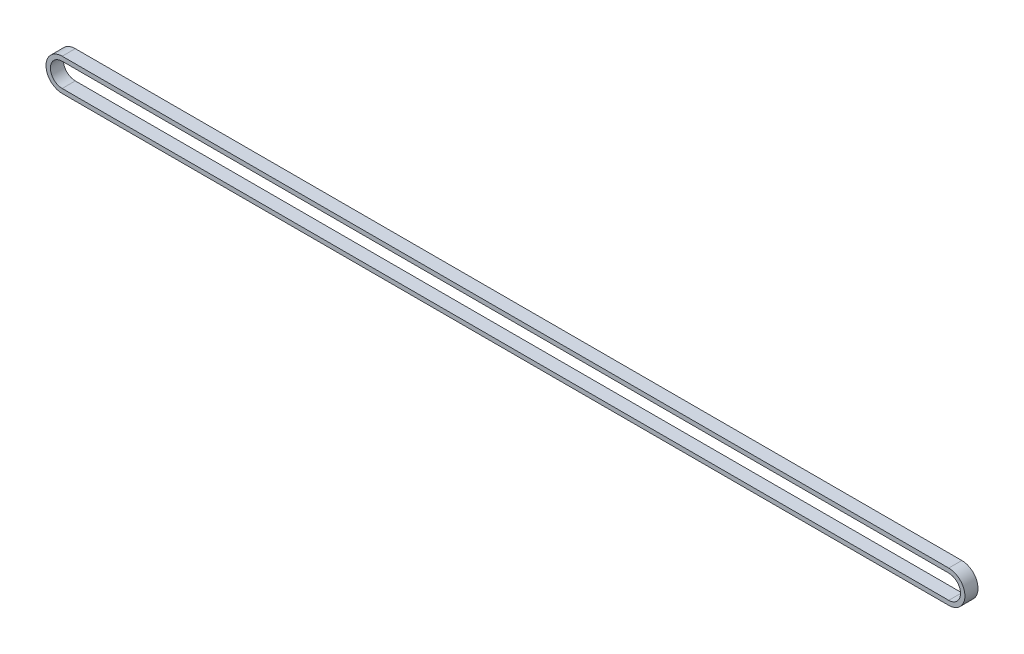
ISO-10303-21;
HEADER;
FILE_DESCRIPTION(('STEP AP214'),'2;1');
FILE_NAME('part.step','',(''),(''),'','','');
FILE_SCHEMA(('AUTOMOTIVE_DESIGN { 1 0 10303 214 1 1 1 1 }'));
ENDSEC;
DATA;
#1=APPLICATION_CONTEXT('core data for automotive mechanical design processes');
#2=APPLICATION_PROTOCOL_DEFINITION('international standard','automotive_design',2000,#1);
#3=PRODUCT_CONTEXT('',#1,'mechanical');
#4=PRODUCT('Part','Part','',(#3));
#5=PRODUCT_RELATED_PRODUCT_CATEGORY('part','',(#4));
#6=PRODUCT_DEFINITION_FORMATION('','',#4);
#7=PRODUCT_DEFINITION_CONTEXT('part definition',#1,'design');
#8=PRODUCT_DEFINITION('design','',#6,#7);
#9=PRODUCT_DEFINITION_SHAPE('','',#8);
#10=(LENGTH_UNIT() NAMED_UNIT(*) SI_UNIT(.MILLI.,.METRE.));
#11=(NAMED_UNIT(*) PLANE_ANGLE_UNIT() SI_UNIT($,.RADIAN.));
#12=(NAMED_UNIT(*) SI_UNIT($,.STERADIAN.) SOLID_ANGLE_UNIT());
#13=UNCERTAINTY_MEASURE_WITH_UNIT(LENGTH_MEASURE(1.E-05),#10,'distance_accuracy_value','');
#14=(GEOMETRIC_REPRESENTATION_CONTEXT(3) GLOBAL_UNCERTAINTY_ASSIGNED_CONTEXT((#13)) GLOBAL_UNIT_ASSIGNED_CONTEXT((#10,
#11,#12)) REPRESENTATION_CONTEXT('',''));
#15=CARTESIAN_POINT('',(0.,0.,0.));
#16=DIRECTION('',(0.,0.,1.));
#17=DIRECTION('',(1.,0.,0.));
#18=AXIS2_PLACEMENT_3D('',#15,#16,#17);
#19=CARTESIAN_POINT('',(0.,-7.4,3.));
#20=DIRECTION('',(0.,1.,0.));
#21=DIRECTION('',(0.,0.,1.));
#22=AXIS2_PLACEMENT_3D('',#19,#20,#21);
#23=PLANE('',#22);
#24=DIRECTION('',(1.,0.,0.));
#25=VECTOR('',#24,1.);
#26=CARTESIAN_POINT('',(0.,-7.4,-3.));
#27=LINE('',#26,#25);
#28=CARTESIAN_POINT('',(-203.,-7.40000000000001,-3.));
#29=VERTEX_POINT('',#28);
#30=CARTESIAN_POINT('',(203.,-7.40000000000001,-3.));
#31=VERTEX_POINT('',#30);
#32=EDGE_CURVE('E143',#29,#31,#27,.T.);
#33=ORIENTED_EDGE('',*,*,#32,.T.);
#34=DIRECTION('',(0.,0.,-1.));
#35=VECTOR('',#34,1.);
#36=CARTESIAN_POINT('',(203.,-7.40000000000001,3.));
#37=LINE('',#36,#35);
#38=CARTESIAN_POINT('',(203.,-7.40000000000001,3.));
#39=VERTEX_POINT('',#38);
#40=EDGE_CURVE('E11',#39,#31,#37,.T.);
#41=ORIENTED_EDGE('',*,*,#40,.F.);
#42=DIRECTION('',(1.,0.,0.));
#43=VECTOR('',#42,1.);
#44=CARTESIAN_POINT('',(0.,-7.4,3.));
#45=LINE('',#44,#43);
#46=CARTESIAN_POINT('',(-203.,-7.40000000000001,3.));
#47=VERTEX_POINT('',#46);
#48=EDGE_CURVE('E123',#47,#39,#45,.T.);
#49=ORIENTED_EDGE('',*,*,#48,.F.);
#50=DIRECTION('',(0.,0.,-1.));
#51=VECTOR('',#50,1.);
#52=CARTESIAN_POINT('',(-203.,-7.40000000000001,3.));
#53=LINE('',#52,#51);
#54=EDGE_CURVE('E150',#47,#29,#53,.T.);
#55=ORIENTED_EDGE('',*,*,#54,.T.);
#56=EDGE_LOOP('',(#33,#41,#49,#55));
#57=FACE_BOUND('',#56,.T.);
#58=ADVANCED_FACE('F37',(#57),#23,.F.);
#59=CARTESIAN_POINT('',(203.,0.,3.));
#60=DIRECTION('',(0.,0.,-1.));
#61=DIRECTION('',(-1.,0.,0.));
#62=AXIS2_PLACEMENT_3D('',#59,#60,#61);
#63=CYLINDRICAL_SURFACE('',#62,7.40000000000002);
#64=CARTESIAN_POINT('',(203.,0.,-3.));
#65=DIRECTION('',(0.,0.,1.));
#66=DIRECTION('',(1.,0.,0.));
#67=AXIS2_PLACEMENT_3D('',#64,#65,#66);
#68=CIRCLE('',#67,7.40000000000002);
#69=CARTESIAN_POINT('',(203.,7.40000000000001,-3.));
#70=VERTEX_POINT('',#69);
#71=EDGE_CURVE('E114',#70,#31,#68,.F.);
#72=ORIENTED_EDGE('',*,*,#71,.F.);
#73=DIRECTION('',(0.,0.,-1.));
#74=VECTOR('',#73,1.);
#75=CARTESIAN_POINT('',(203.,7.40000000000001,3.));
#76=LINE('',#75,#74);
#77=CARTESIAN_POINT('',(203.,7.40000000000001,3.));
#78=VERTEX_POINT('',#77);
#79=EDGE_CURVE('E47',#78,#70,#76,.T.);
#80=ORIENTED_EDGE('',*,*,#79,.F.);
#81=CARTESIAN_POINT('',(203.,0.,3.));
#82=DIRECTION('',(0.,0.,1.));
#83=DIRECTION('',(1.,0.,0.));
#84=AXIS2_PLACEMENT_3D('',#81,#82,#83);
#85=CIRCLE('',#84,7.40000000000002);
#86=EDGE_CURVE('E112',#78,#39,#85,.F.);
#87=ORIENTED_EDGE('',*,*,#86,.T.);
#88=ORIENTED_EDGE('',*,*,#40,.T.);
#89=EDGE_LOOP('',(#72,#80,#87,#88));
#90=FACE_BOUND('',#89,.T.);
#91=ADVANCED_FACE('F111',(#90),#63,.T.);
#92=CARTESIAN_POINT('',(0.,7.4,3.));
#93=DIRECTION('',(0.,1.,0.));
#94=DIRECTION('',(0.,0.,1.));
#95=AXIS2_PLACEMENT_3D('',#92,#93,#94);
#96=PLANE('',#95);
#97=DIRECTION('',(1.,0.,0.));
#98=VECTOR('',#97,1.);
#99=CARTESIAN_POINT('',(0.,7.4,-3.));
#100=LINE('',#99,#98);
#101=CARTESIAN_POINT('',(-203.,7.40000000000001,-3.));
#102=VERTEX_POINT('',#101);
#103=EDGE_CURVE('E147',#102,#70,#100,.T.);
#104=ORIENTED_EDGE('',*,*,#103,.F.);
#105=DIRECTION('',(0.,0.,-1.));
#106=VECTOR('',#105,1.);
#107=CARTESIAN_POINT('',(-203.,7.40000000000001,3.));
#108=LINE('',#107,#106);
#109=CARTESIAN_POINT('',(-203.,7.40000000000001,3.));
#110=VERTEX_POINT('',#109);
#111=EDGE_CURVE('E83',#110,#102,#108,.T.);
#112=ORIENTED_EDGE('',*,*,#111,.F.);
#113=DIRECTION('',(1.,0.,0.));
#114=VECTOR('',#113,1.);
#115=CARTESIAN_POINT('',(0.,7.4,3.));
#116=LINE('',#115,#114);
#117=EDGE_CURVE('E121',#110,#78,#116,.T.);
#118=ORIENTED_EDGE('',*,*,#117,.T.);
#119=ORIENTED_EDGE('',*,*,#79,.T.);
#120=EDGE_LOOP('',(#104,#112,#118,#119));
#121=FACE_BOUND('',#120,.T.);
#122=ADVANCED_FACE('F126',(#121),#96,.T.);
#123=CARTESIAN_POINT('',(203.,0.,3.));
#124=DIRECTION('',(0.,0.,-1.));
#125=DIRECTION('',(-1.,0.,0.));
#126=AXIS2_PLACEMENT_3D('',#123,#124,#125);
#127=CYLINDRICAL_SURFACE('',#126,5.40000000000002);
#128=CARTESIAN_POINT('',(203.,0.,-3.));
#129=DIRECTION('',(0.,0.,1.));
#130=DIRECTION('',(1.,0.,0.));
#131=AXIS2_PLACEMENT_3D('',#128,#129,#130);
#132=CIRCLE('',#131,5.40000000000002);
#133=CARTESIAN_POINT('',(203.,5.4,-3.));
#134=VERTEX_POINT('',#133);
#135=CARTESIAN_POINT('',(203.,-5.4,-3.));
#136=VERTEX_POINT('',#135);
#137=EDGE_CURVE('E132',#134,#136,#132,.F.);
#138=ORIENTED_EDGE('',*,*,#137,.T.);
#139=DIRECTION('',(0.,0.,-1.));
#140=VECTOR('',#139,1.);
#141=CARTESIAN_POINT('',(203.,-5.4,3.));
#142=LINE('',#141,#140);
#143=CARTESIAN_POINT('',(203.,-5.4,3.));
#144=VERTEX_POINT('',#143);
#145=EDGE_CURVE('E41',#144,#136,#142,.T.);
#146=ORIENTED_EDGE('',*,*,#145,.F.);
#147=CARTESIAN_POINT('',(203.,0.,3.));
#148=DIRECTION('',(0.,0.,1.));
#149=DIRECTION('',(1.,0.,0.));
#150=AXIS2_PLACEMENT_3D('',#147,#148,#149);
#151=CIRCLE('',#150,5.40000000000002);
#152=CARTESIAN_POINT('',(203.,5.4,3.));
#153=VERTEX_POINT('',#152);
#154=EDGE_CURVE('E95',#153,#144,#151,.F.);
#155=ORIENTED_EDGE('',*,*,#154,.F.);
#156=DIRECTION('',(0.,0.,-1.));
#157=VECTOR('',#156,1.);
#158=CARTESIAN_POINT('',(203.,5.4,3.));
#159=LINE('',#158,#157);
#160=EDGE_CURVE('E128',#153,#134,#159,.T.);
#161=ORIENTED_EDGE('',*,*,#160,.T.);
#162=EDGE_LOOP('',(#138,#146,#155,#161));
#163=FACE_BOUND('',#162,.T.);
#164=ADVANCED_FACE('F39',(#163),#127,.F.);
#165=CARTESIAN_POINT('',(0.,-5.4,3.));
#166=DIRECTION('',(0.,1.,0.));
#167=DIRECTION('',(0.,0.,1.));
#168=AXIS2_PLACEMENT_3D('',#165,#166,#167);
#169=PLANE('',#168);
#170=DIRECTION('',(1.,0.,0.));
#171=VECTOR('',#170,1.);
#172=CARTESIAN_POINT('',(0.,-5.4,-3.));
#173=LINE('',#172,#171);
#174=CARTESIAN_POINT('',(-203.,-5.4,-3.));
#175=VERTEX_POINT('',#174);
#176=EDGE_CURVE('E135',#175,#136,#173,.T.);
#177=ORIENTED_EDGE('',*,*,#176,.F.);
#178=DIRECTION('',(0.,0.,-1.));
#179=VECTOR('',#178,1.);
#180=CARTESIAN_POINT('',(-203.,-5.4,3.));
#181=LINE('',#180,#179);
#182=CARTESIAN_POINT('',(-203.,-5.4,3.));
#183=VERTEX_POINT('',#182);
#184=EDGE_CURVE('E156',#183,#175,#181,.T.);
#185=ORIENTED_EDGE('',*,*,#184,.F.);
#186=DIRECTION('',(1.,0.,0.));
#187=VECTOR('',#186,1.);
#188=CARTESIAN_POINT('',(0.,-5.4,3.));
#189=LINE('',#188,#187);
#190=EDGE_CURVE('E164',#183,#144,#189,.T.);
#191=ORIENTED_EDGE('',*,*,#190,.T.);
#192=ORIENTED_EDGE('',*,*,#145,.T.);
#193=EDGE_LOOP('',(#177,#185,#191,#192));
#194=FACE_BOUND('',#193,.T.);
#195=ADVANCED_FACE('F163',(#194),#169,.T.);
#196=CARTESIAN_POINT('',(-203.,0.,3.));
#197=DIRECTION('',(0.,0.,-1.));
#198=DIRECTION('',(-1.,0.,0.));
#199=AXIS2_PLACEMENT_3D('',#196,#197,#198);
#200=CYLINDRICAL_SURFACE('',#199,5.40000000000002);
#201=CARTESIAN_POINT('',(-203.,0.,-3.));
#202=DIRECTION('',(0.,0.,1.));
#203=DIRECTION('',(1.,0.,0.));
#204=AXIS2_PLACEMENT_3D('',#201,#202,#203);
#205=CIRCLE('',#204,5.40000000000002);
#206=CARTESIAN_POINT('',(-203.,5.4,-3.));
#207=VERTEX_POINT('',#206);
#208=EDGE_CURVE('E138',#207,#175,#205,.T.);
#209=ORIENTED_EDGE('',*,*,#208,.F.);
#210=DIRECTION('',(0.,0.,-1.));
#211=VECTOR('',#210,1.);
#212=CARTESIAN_POINT('',(-203.,5.4,3.));
#213=LINE('',#212,#211);
#214=CARTESIAN_POINT('',(-203.,5.4,3.));
#215=VERTEX_POINT('',#214);
#216=EDGE_CURVE('E155',#215,#207,#213,.T.);
#217=ORIENTED_EDGE('',*,*,#216,.F.);
#218=CARTESIAN_POINT('',(-203.,0.,3.));
#219=DIRECTION('',(0.,0.,1.));
#220=DIRECTION('',(1.,0.,0.));
#221=AXIS2_PLACEMENT_3D('',#218,#219,#220);
#222=CIRCLE('',#221,5.40000000000002);
#223=EDGE_CURVE('E175',#215,#183,#222,.T.);
#224=ORIENTED_EDGE('',*,*,#223,.T.);
#225=ORIENTED_EDGE('',*,*,#184,.T.);
#226=EDGE_LOOP('',(#209,#217,#224,#225));
#227=FACE_BOUND('',#226,.T.);
#228=ADVANCED_FACE('F172',(#227),#200,.F.);
#229=CARTESIAN_POINT('',(0.,5.4,3.));
#230=DIRECTION('',(0.,1.,0.));
#231=DIRECTION('',(0.,0.,1.));
#232=AXIS2_PLACEMENT_3D('',#229,#230,#231);
#233=PLANE('',#232);
#234=DIRECTION('',(1.,0.,0.));
#235=VECTOR('',#234,1.);
#236=CARTESIAN_POINT('',(0.,5.4,-3.));
#237=LINE('',#236,#235);
#238=EDGE_CURVE('E141',#207,#134,#237,.T.);
#239=ORIENTED_EDGE('',*,*,#238,.T.);
#240=ORIENTED_EDGE('',*,*,#160,.F.);
#241=DIRECTION('',(1.,0.,0.));
#242=VECTOR('',#241,1.);
#243=CARTESIAN_POINT('',(0.,5.4,3.));
#244=LINE('',#243,#242);
#245=EDGE_CURVE('E177',#215,#153,#244,.T.);
#246=ORIENTED_EDGE('',*,*,#245,.F.);
#247=ORIENTED_EDGE('',*,*,#216,.T.);
#248=EDGE_LOOP('',(#239,#240,#246,#247));
#249=FACE_BOUND('',#248,.T.);
#250=ADVANCED_FACE('F178',(#249),#233,.F.);
#251=CARTESIAN_POINT('',(-203.,0.,3.));
#252=DIRECTION('',(0.,0.,-1.));
#253=DIRECTION('',(-1.,0.,0.));
#254=AXIS2_PLACEMENT_3D('',#251,#252,#253);
#255=CYLINDRICAL_SURFACE('',#254,7.40000000000002);
#256=CARTESIAN_POINT('',(-203.,0.,-3.));
#257=DIRECTION('',(0.,0.,1.));
#258=DIRECTION('',(1.,0.,0.));
#259=AXIS2_PLACEMENT_3D('',#256,#257,#258);
#260=CIRCLE('',#259,7.40000000000002);
#261=EDGE_CURVE('E86',#102,#29,#260,.T.);
#262=ORIENTED_EDGE('',*,*,#261,.T.);
#263=ORIENTED_EDGE('',*,*,#54,.F.);
#264=CARTESIAN_POINT('',(-203.,0.,3.));
#265=DIRECTION('',(0.,0.,1.));
#266=DIRECTION('',(1.,0.,0.));
#267=AXIS2_PLACEMENT_3D('',#264,#265,#266);
#268=CIRCLE('',#267,7.40000000000002);
#269=EDGE_CURVE('E56',#110,#47,#268,.T.);
#270=ORIENTED_EDGE('',*,*,#269,.F.);
#271=ORIENTED_EDGE('',*,*,#111,.T.);
#272=EDGE_LOOP('',(#262,#263,#270,#271));
#273=FACE_BOUND('',#272,.T.);
#274=ADVANCED_FACE('F184',(#273),#255,.T.);
#275=CARTESIAN_POINT('',(0.,0.,3.));
#276=DIRECTION('',(0.,0.,1.));
#277=DIRECTION('',(1.,0.,0.));
#278=AXIS2_PLACEMENT_3D('',#275,#276,#277);
#279=PLANE('',#278);
#280=ORIENTED_EDGE('',*,*,#154,.T.);
#281=ORIENTED_EDGE('',*,*,#190,.F.);
#282=ORIENTED_EDGE('',*,*,#223,.F.);
#283=ORIENTED_EDGE('',*,*,#245,.T.);
#284=EDGE_LOOP('',(#280,#281,#282,#283));
#285=FACE_BOUND('',#284,.T.);
#286=ORIENTED_EDGE('',*,*,#48,.T.);
#287=ORIENTED_EDGE('',*,*,#86,.F.);
#288=ORIENTED_EDGE('',*,*,#117,.F.);
#289=ORIENTED_EDGE('',*,*,#269,.T.);
#290=EDGE_LOOP('',(#286,#287,#288,#289));
#291=FACE_BOUND('',#290,.T.);
#292=ADVANCED_FACE('F120',(#285,#291),#279,.T.);
#293=CARTESIAN_POINT('',(0.,0.,-3.));
#294=DIRECTION('',(0.,0.,1.));
#295=DIRECTION('',(1.,0.,0.));
#296=AXIS2_PLACEMENT_3D('',#293,#294,#295);
#297=PLANE('',#296);
#298=ORIENTED_EDGE('',*,*,#137,.F.);
#299=ORIENTED_EDGE('',*,*,#238,.F.);
#300=ORIENTED_EDGE('',*,*,#208,.T.);
#301=ORIENTED_EDGE('',*,*,#176,.T.);
#302=EDGE_LOOP('',(#298,#299,#300,#301));
#303=FACE_BOUND('',#302,.T.);
#304=ORIENTED_EDGE('',*,*,#32,.F.);
#305=ORIENTED_EDGE('',*,*,#261,.F.);
#306=ORIENTED_EDGE('',*,*,#103,.T.);
#307=ORIENTED_EDGE('',*,*,#71,.T.);
#308=EDGE_LOOP('',(#304,#305,#306,#307));
#309=FACE_BOUND('',#308,.T.);
#310=ADVANCED_FACE('F170',(#303,#309),#297,.F.);
#311=CLOSED_SHELL('',(#58,#91,#122,#164,#195,#228,#250,#274,#292,#310));
#312=MANIFOLD_SOLID_BREP('B2',#311);
#313=ADVANCED_BREP_SHAPE_REPRESENTATION('',(#18,#312),#14);
#314=SHAPE_DEFINITION_REPRESENTATION(#9,#313);
ENDSEC;
END-ISO-10303-21;
